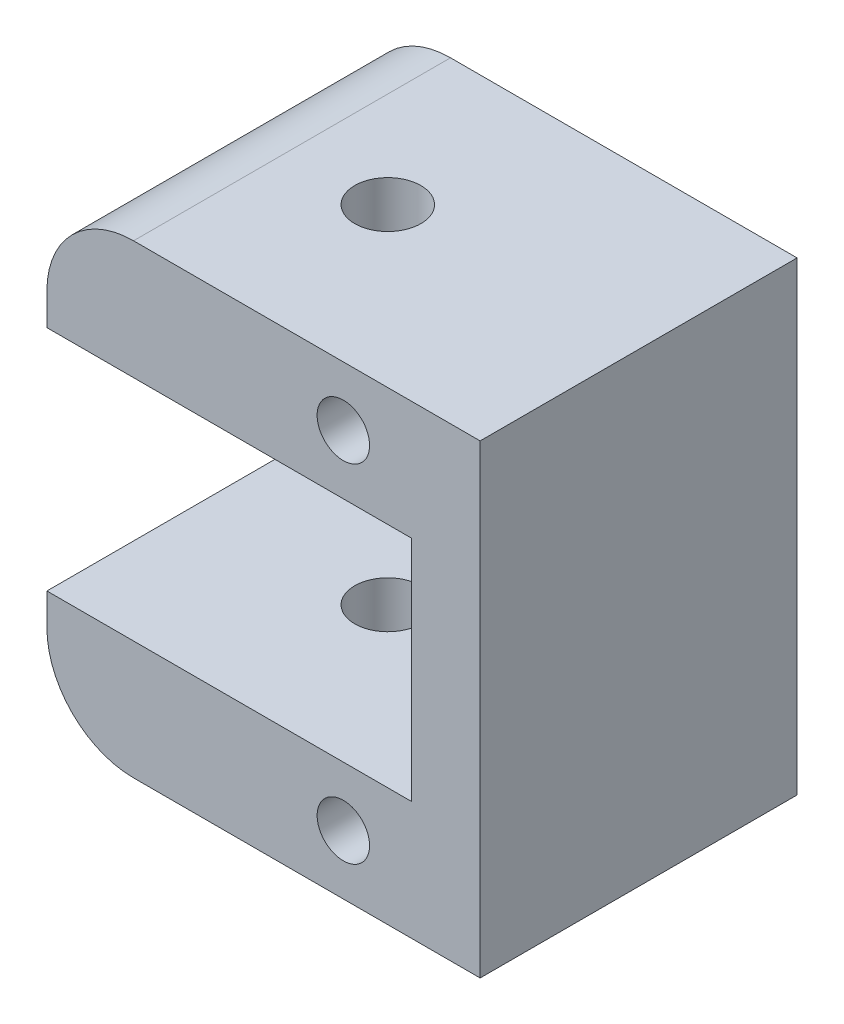
ISO-10303-21;
HEADER;
FILE_DESCRIPTION(('STEP AP214'),'2;1');
FILE_NAME('part.step','',(''),(''),'','','');
FILE_SCHEMA(('AUTOMOTIVE_DESIGN { 1 0 10303 214 1 1 1 1 }'));
ENDSEC;
DATA;
#1=APPLICATION_CONTEXT('core data for automotive mechanical design processes');
#2=APPLICATION_PROTOCOL_DEFINITION('international standard','automotive_design',2000,#1);
#3=PRODUCT_CONTEXT('',#1,'mechanical');
#4=PRODUCT('Part','Part','',(#3));
#5=PRODUCT_RELATED_PRODUCT_CATEGORY('part','',(#4));
#6=PRODUCT_DEFINITION_FORMATION('','',#4);
#7=PRODUCT_DEFINITION_CONTEXT('part definition',#1,'design');
#8=PRODUCT_DEFINITION('design','',#6,#7);
#9=PRODUCT_DEFINITION_SHAPE('','',#8);
#10=(LENGTH_UNIT() NAMED_UNIT(*) SI_UNIT(.MILLI.,.METRE.));
#11=(NAMED_UNIT(*) PLANE_ANGLE_UNIT() SI_UNIT($,.RADIAN.));
#12=(NAMED_UNIT(*) SI_UNIT($,.STERADIAN.) SOLID_ANGLE_UNIT());
#13=UNCERTAINTY_MEASURE_WITH_UNIT(LENGTH_MEASURE(1.E-05),#10,'distance_accuracy_value','');
#14=(GEOMETRIC_REPRESENTATION_CONTEXT(3) GLOBAL_UNCERTAINTY_ASSIGNED_CONTEXT((#13)) GLOBAL_UNIT_ASSIGNED_CONTEXT((#10,
#11,#12)) REPRESENTATION_CONTEXT('',''));
#15=CARTESIAN_POINT('',(0.,0.,0.));
#16=DIRECTION('',(0.,0.,1.));
#17=DIRECTION('',(1.,0.,0.));
#18=AXIS2_PLACEMENT_3D('',#15,#16,#17);
#19=CARTESIAN_POINT('',(11.,10.2,-13.9));
#20=DIRECTION('',(0.,1.,0.));
#21=DIRECTION('',(-1.,0.,0.));
#22=AXIS2_PLACEMENT_3D('',#19,#20,#21);
#23=PLANE('',#22);
#24=CARTESIAN_POINT('',(0.,10.2,-6.95));
#25=DIRECTION('',(0.,1.,0.));
#26=DIRECTION('',(-1.,0.,0.));
#27=AXIS2_PLACEMENT_3D('',#24,#25,#26);
#28=CIRCLE('',#27,1.45);
#29=CARTESIAN_POINT('',(-1.45,10.2,-6.95));
#30=VERTEX_POINT('',#29);
#31=EDGE_CURVE('E261',#30,#30,#28,.T.);
#32=ORIENTED_EDGE('',*,*,#31,.F.);
#33=EDGE_LOOP('',(#32));
#34=FACE_BOUND('',#33,.T.);
#35=DIRECTION('',(-1.,0.,0.));
#36=VECTOR('',#35,1.);
#37=CARTESIAN_POINT('',(11.,10.2,-13.9));
#38=LINE('',#37,#36);
#39=CARTESIAN_POINT('',(11.,10.2,-13.9));
#40=VERTEX_POINT('',#39);
#41=CARTESIAN_POINT('',(-4.2,10.2,-13.9));
#42=VERTEX_POINT('',#41);
#43=EDGE_CURVE('E123',#40,#42,#38,.T.);
#44=ORIENTED_EDGE('',*,*,#43,.T.);
#45=DIRECTION('',(0.,0.,1.));
#46=VECTOR('',#45,1.);
#47=CARTESIAN_POINT('',(-4.2,10.2,-13.9));
#48=LINE('',#47,#46);
#49=CARTESIAN_POINT('',(-4.2,10.2,0.));
#50=VERTEX_POINT('',#49);
#51=EDGE_CURVE('E48',#42,#50,#48,.T.);
#52=ORIENTED_EDGE('',*,*,#51,.T.);
#53=DIRECTION('',(-1.,0.,0.));
#54=VECTOR('',#53,1.);
#55=CARTESIAN_POINT('',(11.,10.2,0.));
#56=LINE('',#55,#54);
#57=CARTESIAN_POINT('',(11.,10.2,0.));
#58=VERTEX_POINT('',#57);
#59=EDGE_CURVE('E160',#58,#50,#56,.T.);
#60=ORIENTED_EDGE('',*,*,#59,.F.);
#61=DIRECTION('',(0.,0.,1.));
#62=VECTOR('',#61,1.);
#63=CARTESIAN_POINT('',(11.,10.2,-13.9));
#64=LINE('',#63,#62);
#65=EDGE_CURVE('E189',#40,#58,#64,.T.);
#66=ORIENTED_EDGE('',*,*,#65,.F.);
#67=EDGE_LOOP('',(#44,#52,#60,#66));
#68=FACE_BOUND('',#67,.T.);
#69=ADVANCED_FACE('F39',(#34,#68),#23,.T.);
#70=CARTESIAN_POINT('',(11.,-10.2,-13.9));
#71=DIRECTION('',(1.,0.,0.));
#72=DIRECTION('',(0.,0.,-1.));
#73=AXIS2_PLACEMENT_3D('',#70,#71,#72);
#74=PLANE('',#73);
#75=DIRECTION('',(0.,1.,0.));
#76=VECTOR('',#75,1.);
#77=CARTESIAN_POINT('',(11.,-10.2,0.));
#78=LINE('',#77,#76);
#79=CARTESIAN_POINT('',(11.,-10.2,0.));
#80=VERTEX_POINT('',#79);
#81=EDGE_CURVE('E185',#80,#58,#78,.T.);
#82=ORIENTED_EDGE('',*,*,#81,.F.);
#83=DIRECTION('',(0.,0.,1.));
#84=VECTOR('',#83,1.);
#85=CARTESIAN_POINT('',(11.,-10.2,-13.9));
#86=LINE('',#85,#84);
#87=CARTESIAN_POINT('',(11.,-10.2,-13.9));
#88=VERTEX_POINT('',#87);
#89=EDGE_CURVE('E193',#88,#80,#86,.T.);
#90=ORIENTED_EDGE('',*,*,#89,.F.);
#91=DIRECTION('',(0.,1.,0.));
#92=VECTOR('',#91,1.);
#93=CARTESIAN_POINT('',(11.,-10.2,-13.9));
#94=LINE('',#93,#92);
#95=EDGE_CURVE('E132',#88,#40,#94,.T.);
#96=ORIENTED_EDGE('',*,*,#95,.T.);
#97=ORIENTED_EDGE('',*,*,#65,.T.);
#98=EDGE_LOOP('',(#82,#90,#96,#97));
#99=FACE_BOUND('',#98,.T.);
#100=ADVANCED_FACE('F247',(#99),#74,.T.);
#101=CARTESIAN_POINT('',(-7.99999999999999,-10.2,-13.9));
#102=DIRECTION('',(0.,-1.,0.));
#103=DIRECTION('',(0.,0.,-1.));
#104=AXIS2_PLACEMENT_3D('',#101,#102,#103);
#105=PLANE('',#104);
#106=CARTESIAN_POINT('',(0.,-10.2,-6.95));
#107=DIRECTION('',(0.,1.,0.));
#108=DIRECTION('',(-1.,0.,0.));
#109=AXIS2_PLACEMENT_3D('',#106,#107,#108);
#110=CIRCLE('',#109,1.45);
#111=CARTESIAN_POINT('',(-1.45,-10.2,-6.95));
#112=VERTEX_POINT('',#111);
#113=EDGE_CURVE('E218',#112,#112,#110,.T.);
#114=ORIENTED_EDGE('',*,*,#113,.T.);
#115=EDGE_LOOP('',(#114));
#116=FACE_BOUND('',#115,.T.);
#117=DIRECTION('',(1.,0.,0.));
#118=VECTOR('',#117,1.);
#119=CARTESIAN_POINT('',(-7.99999999999999,-10.2,0.));
#120=LINE('',#119,#118);
#121=CARTESIAN_POINT('',(-4.2,-10.2,0.));
#122=VERTEX_POINT('',#121);
#123=EDGE_CURVE('E182',#122,#80,#120,.T.);
#124=ORIENTED_EDGE('',*,*,#123,.F.);
#125=DIRECTION('',(0.,0.,1.));
#126=VECTOR('',#125,1.);
#127=CARTESIAN_POINT('',(-4.2,-10.2,-13.9));
#128=LINE('',#127,#126);
#129=CARTESIAN_POINT('',(-4.2,-10.2,-13.9));
#130=VERTEX_POINT('',#129);
#131=EDGE_CURVE('E228',#122,#130,#128,.F.);
#132=ORIENTED_EDGE('',*,*,#131,.T.);
#133=DIRECTION('',(1.,0.,0.));
#134=VECTOR('',#133,1.);
#135=CARTESIAN_POINT('',(-7.99999999999999,-10.2,-13.9));
#136=LINE('',#135,#134);
#137=EDGE_CURVE('E154',#130,#88,#136,.T.);
#138=ORIENTED_EDGE('',*,*,#137,.T.);
#139=ORIENTED_EDGE('',*,*,#89,.T.);
#140=EDGE_LOOP('',(#124,#132,#138,#139));
#141=FACE_BOUND('',#140,.T.);
#142=ADVANCED_FACE('F269',(#116,#141),#105,.T.);
#143=CARTESIAN_POINT('',(-8.,-5.,-13.9));
#144=DIRECTION('',(-1.,0.,0.));
#145=DIRECTION('',(0.,-1.,0.));
#146=AXIS2_PLACEMENT_3D('',#143,#144,#145);
#147=PLANE('',#146);
#148=DIRECTION('',(0.,-1.,0.));
#149=VECTOR('',#148,1.);
#150=CARTESIAN_POINT('',(-8.,-5.,-13.9));
#151=LINE('',#150,#149);
#152=CARTESIAN_POINT('',(-8.,-5.,-13.9));
#153=VERTEX_POINT('',#152);
#154=CARTESIAN_POINT('',(-7.99999999999999,-6.40000000000001,-13.9));
#155=VERTEX_POINT('',#154);
#156=EDGE_CURVE('E150',#153,#155,#151,.T.);
#157=ORIENTED_EDGE('',*,*,#156,.T.);
#158=DIRECTION('',(0.,0.,1.));
#159=VECTOR('',#158,1.);
#160=CARTESIAN_POINT('',(-7.99999999999999,-6.40000000000001,-13.9));
#161=LINE('',#160,#159);
#162=CARTESIAN_POINT('',(-7.99999999999999,-6.40000000000001,0.));
#163=VERTEX_POINT('',#162);
#164=EDGE_CURVE('E192',#155,#163,#161,.T.);
#165=ORIENTED_EDGE('',*,*,#164,.T.);
#166=DIRECTION('',(0.,-1.,0.));
#167=VECTOR('',#166,1.);
#168=CARTESIAN_POINT('',(-8.,-5.,0.));
#169=LINE('',#168,#167);
#170=CARTESIAN_POINT('',(-8.,-5.,0.));
#171=VERTEX_POINT('',#170);
#172=EDGE_CURVE('E178',#171,#163,#169,.T.);
#173=ORIENTED_EDGE('',*,*,#172,.F.);
#174=DIRECTION('',(0.,0.,1.));
#175=VECTOR('',#174,1.);
#176=CARTESIAN_POINT('',(-8.,-5.,-13.9));
#177=LINE('',#176,#175);
#178=EDGE_CURVE('E197',#153,#171,#177,.T.);
#179=ORIENTED_EDGE('',*,*,#178,.F.);
#180=EDGE_LOOP('',(#157,#165,#173,#179));
#181=FACE_BOUND('',#180,.T.);
#182=ADVANCED_FACE('F307',(#181),#147,.T.);
#183=CARTESIAN_POINT('',(8.,-5.,-13.9));
#184=DIRECTION('',(0.,1.,0.));
#185=DIRECTION('',(-1.,0.,0.));
#186=AXIS2_PLACEMENT_3D('',#183,#184,#185);
#187=PLANE('',#186);
#188=CARTESIAN_POINT('',(0.,-5.,-6.95));
#189=DIRECTION('',(0.,1.,0.));
#190=DIRECTION('',(-1.,0.,0.));
#191=AXIS2_PLACEMENT_3D('',#188,#189,#190);
#192=CIRCLE('',#191,1.45);
#193=CARTESIAN_POINT('',(-1.45,-5.,-6.95));
#194=VERTEX_POINT('',#193);
#195=EDGE_CURVE('E217',#194,#194,#192,.T.);
#196=ORIENTED_EDGE('',*,*,#195,.F.);
#197=EDGE_LOOP('',(#196));
#198=FACE_BOUND('',#197,.T.);
#199=DIRECTION('',(-1.,0.,0.));
#200=VECTOR('',#199,1.);
#201=CARTESIAN_POINT('',(8.,-5.,0.));
#202=LINE('',#201,#200);
#203=CARTESIAN_POINT('',(8.,-5.,0.));
#204=VERTEX_POINT('',#203);
#205=EDGE_CURVE('E174',#204,#171,#202,.T.);
#206=ORIENTED_EDGE('',*,*,#205,.F.);
#207=DIRECTION('',(0.,0.,1.));
#208=VECTOR('',#207,1.);
#209=CARTESIAN_POINT('',(8.,-5.,-13.9));
#210=LINE('',#209,#208);
#211=CARTESIAN_POINT('',(8.,-5.,-13.9));
#212=VERTEX_POINT('',#211);
#213=EDGE_CURVE('E200',#212,#204,#210,.T.);
#214=ORIENTED_EDGE('',*,*,#213,.F.);
#215=DIRECTION('',(-1.,0.,0.));
#216=VECTOR('',#215,1.);
#217=CARTESIAN_POINT('',(8.,-5.,-13.9));
#218=LINE('',#217,#216);
#219=EDGE_CURVE('E143',#212,#153,#218,.T.);
#220=ORIENTED_EDGE('',*,*,#219,.T.);
#221=ORIENTED_EDGE('',*,*,#178,.T.);
#222=EDGE_LOOP('',(#206,#214,#220,#221));
#223=FACE_BOUND('',#222,.T.);
#224=ADVANCED_FACE('F303',(#198,#223),#187,.T.);
#225=CARTESIAN_POINT('',(8.,5.,-13.9));
#226=DIRECTION('',(-1.,0.,0.));
#227=DIRECTION('',(0.,-1.,0.));
#228=AXIS2_PLACEMENT_3D('',#225,#226,#227);
#229=PLANE('',#228);
#230=DIRECTION('',(0.,-1.,0.));
#231=VECTOR('',#230,1.);
#232=CARTESIAN_POINT('',(8.,5.,0.));
#233=LINE('',#232,#231);
#234=CARTESIAN_POINT('',(8.,5.,0.));
#235=VERTEX_POINT('',#234);
#236=EDGE_CURVE('E170',#235,#204,#233,.T.);
#237=ORIENTED_EDGE('',*,*,#236,.F.);
#238=DIRECTION('',(0.,0.,1.));
#239=VECTOR('',#238,1.);
#240=CARTESIAN_POINT('',(8.,5.,-13.9));
#241=LINE('',#240,#239);
#242=CARTESIAN_POINT('',(8.,5.,-13.9));
#243=VERTEX_POINT('',#242);
#244=EDGE_CURVE('E131',#243,#235,#241,.T.);
#245=ORIENTED_EDGE('',*,*,#244,.F.);
#246=DIRECTION('',(0.,-1.,0.));
#247=VECTOR('',#246,1.);
#248=CARTESIAN_POINT('',(8.,5.,-13.9));
#249=LINE('',#248,#247);
#250=EDGE_CURVE('E139',#243,#212,#249,.T.);
#251=ORIENTED_EDGE('',*,*,#250,.T.);
#252=ORIENTED_EDGE('',*,*,#213,.T.);
#253=EDGE_LOOP('',(#237,#245,#251,#252));
#254=FACE_BOUND('',#253,.T.);
#255=ADVANCED_FACE('F299',(#254),#229,.T.);
#256=CARTESIAN_POINT('',(-8.,5.,-13.9));
#257=DIRECTION('',(0.,-1.,0.));
#258=DIRECTION('',(0.,0.,-1.));
#259=AXIS2_PLACEMENT_3D('',#256,#257,#258);
#260=PLANE('',#259);
#261=CARTESIAN_POINT('',(0.,5.,-6.95));
#262=DIRECTION('',(0.,-1.,0.));
#263=DIRECTION('',(0.,0.,-1.));
#264=AXIS2_PLACEMENT_3D('',#261,#262,#263);
#265=CIRCLE('',#264,1.45);
#266=CARTESIAN_POINT('',(0.,5.,-8.4));
#267=VERTEX_POINT('',#266);
#268=EDGE_CURVE('E213',#267,#267,#265,.T.);
#269=ORIENTED_EDGE('',*,*,#268,.F.);
#270=EDGE_LOOP('',(#269));
#271=FACE_BOUND('',#270,.T.);
#272=DIRECTION('',(1.,0.,0.));
#273=VECTOR('',#272,1.);
#274=CARTESIAN_POINT('',(-8.,5.,0.));
#275=LINE('',#274,#273);
#276=CARTESIAN_POINT('',(-8.,5.,0.));
#277=VERTEX_POINT('',#276);
#278=EDGE_CURVE('E129',#277,#235,#275,.T.);
#279=ORIENTED_EDGE('',*,*,#278,.F.);
#280=DIRECTION('',(0.,0.,1.));
#281=VECTOR('',#280,1.);
#282=CARTESIAN_POINT('',(-8.,5.,-13.9));
#283=LINE('',#282,#281);
#284=CARTESIAN_POINT('',(-8.,5.,-13.9));
#285=VERTEX_POINT('',#284);
#286=EDGE_CURVE('E118',#285,#277,#283,.T.);
#287=ORIENTED_EDGE('',*,*,#286,.F.);
#288=DIRECTION('',(1.,0.,0.));
#289=VECTOR('',#288,1.);
#290=CARTESIAN_POINT('',(-8.,5.,-13.9));
#291=LINE('',#290,#289);
#292=EDGE_CURVE('E122',#285,#243,#291,.T.);
#293=ORIENTED_EDGE('',*,*,#292,.T.);
#294=ORIENTED_EDGE('',*,*,#244,.T.);
#295=EDGE_LOOP('',(#279,#287,#293,#294));
#296=FACE_BOUND('',#295,.T.);
#297=ADVANCED_FACE('F127',(#271,#296),#260,.T.);
#298=CARTESIAN_POINT('',(-8.,10.2,-13.9));
#299=DIRECTION('',(-1.,0.,0.));
#300=DIRECTION('',(0.,-1.,0.));
#301=AXIS2_PLACEMENT_3D('',#298,#299,#300);
#302=PLANE('',#301);
#303=DIRECTION('',(0.,-1.,0.));
#304=VECTOR('',#303,1.);
#305=CARTESIAN_POINT('',(-8.,10.2,0.));
#306=LINE('',#305,#304);
#307=CARTESIAN_POINT('',(-8.,6.4,0.));
#308=VERTEX_POINT('',#307);
#309=EDGE_CURVE('E164',#308,#277,#306,.T.);
#310=ORIENTED_EDGE('',*,*,#309,.F.);
#311=DIRECTION('',(0.,0.,1.));
#312=VECTOR('',#311,1.);
#313=CARTESIAN_POINT('',(-8.,6.4,-13.9));
#314=LINE('',#313,#312);
#315=CARTESIAN_POINT('',(-8.,6.4,-13.9));
#316=VERTEX_POINT('',#315);
#317=EDGE_CURVE('E11',#308,#316,#314,.F.);
#318=ORIENTED_EDGE('',*,*,#317,.T.);
#319=DIRECTION('',(0.,-1.,0.));
#320=VECTOR('',#319,1.);
#321=CARTESIAN_POINT('',(-8.,10.2,-13.9));
#322=LINE('',#321,#320);
#323=EDGE_CURVE('E115',#316,#285,#322,.T.);
#324=ORIENTED_EDGE('',*,*,#323,.T.);
#325=ORIENTED_EDGE('',*,*,#286,.T.);
#326=EDGE_LOOP('',(#310,#318,#324,#325));
#327=FACE_BOUND('',#326,.T.);
#328=ADVANCED_FACE('F117',(#327),#302,.T.);
#329=CARTESIAN_POINT('',(0.,0.,-13.9));
#330=DIRECTION('',(0.,0.,1.));
#331=DIRECTION('',(1.,0.,0.));
#332=AXIS2_PLACEMENT_3D('',#329,#330,#331);
#333=PLANE('',#332);
#334=CARTESIAN_POINT('',(5.,7.6,-13.9));
#335=DIRECTION('',(0.,0.,1.));
#336=DIRECTION('',(1.,0.,0.));
#337=AXIS2_PLACEMENT_3D('',#334,#335,#336);
#338=CIRCLE('',#337,1.15);
#339=CARTESIAN_POINT('',(6.15,7.6,-13.9));
#340=VERTEX_POINT('',#339);
#341=EDGE_CURVE('E209',#340,#340,#338,.T.);
#342=ORIENTED_EDGE('',*,*,#341,.T.);
#343=EDGE_LOOP('',(#342));
#344=FACE_BOUND('',#343,.T.);
#345=CARTESIAN_POINT('',(5.00000000000016,-7.6,-13.9));
#346=DIRECTION('',(0.,0.,1.));
#347=DIRECTION('',(1.,0.,0.));
#348=AXIS2_PLACEMENT_3D('',#345,#346,#347);
#349=CIRCLE('',#348,1.15);
#350=CARTESIAN_POINT('',(6.15000000000016,-7.6,-13.9));
#351=VERTEX_POINT('',#350);
#352=EDGE_CURVE('E251',#351,#351,#349,.T.);
#353=ORIENTED_EDGE('',*,*,#352,.T.);
#354=EDGE_LOOP('',(#353));
#355=FACE_BOUND('',#354,.T.);
#356=ORIENTED_EDGE('',*,*,#137,.F.);
#357=CARTESIAN_POINT('',(-4.2,-6.4,-13.9));
#358=DIRECTION('',(0.,0.,1.));
#359=DIRECTION('',(1.,0.,0.));
#360=AXIS2_PLACEMENT_3D('',#357,#358,#359);
#361=CIRCLE('',#360,3.8);
#362=EDGE_CURVE('E233',#130,#155,#361,.F.);
#363=ORIENTED_EDGE('',*,*,#362,.T.);
#364=ORIENTED_EDGE('',*,*,#156,.F.);
#365=ORIENTED_EDGE('',*,*,#219,.F.);
#366=ORIENTED_EDGE('',*,*,#250,.F.);
#367=ORIENTED_EDGE('',*,*,#292,.F.);
#368=ORIENTED_EDGE('',*,*,#323,.F.);
#369=CARTESIAN_POINT('',(-4.2,6.4,-13.9));
#370=DIRECTION('',(0.,0.,1.));
#371=DIRECTION('',(1.,0.,0.));
#372=AXIS2_PLACEMENT_3D('',#369,#370,#371);
#373=CIRCLE('',#372,3.8);
#374=EDGE_CURVE('E60',#316,#42,#373,.F.);
#375=ORIENTED_EDGE('',*,*,#374,.T.);
#376=ORIENTED_EDGE('',*,*,#43,.F.);
#377=ORIENTED_EDGE('',*,*,#95,.F.);
#378=EDGE_LOOP('',(#356,#363,#364,#365,#366,#367,#368,#375,#376,#377));
#379=FACE_BOUND('',#378,.T.);
#380=ADVANCED_FACE('F136',(#344,#355,#379),#333,.F.);
#381=CARTESIAN_POINT('',(0.,0.,0.));
#382=DIRECTION('',(0.,0.,1.));
#383=DIRECTION('',(1.,0.,0.));
#384=AXIS2_PLACEMENT_3D('',#381,#382,#383);
#385=PLANE('',#384);
#386=CARTESIAN_POINT('',(5.,7.6,0.));
#387=DIRECTION('',(0.,0.,1.));
#388=DIRECTION('',(1.,0.,0.));
#389=AXIS2_PLACEMENT_3D('',#386,#387,#388);
#390=CIRCLE('',#389,1.15);
#391=CARTESIAN_POINT('',(6.15,7.6,0.));
#392=VERTEX_POINT('',#391);
#393=EDGE_CURVE('E165',#392,#392,#390,.T.);
#394=ORIENTED_EDGE('',*,*,#393,.F.);
#395=EDGE_LOOP('',(#394));
#396=FACE_BOUND('',#395,.T.);
#397=CARTESIAN_POINT('',(5.00000000000016,-7.6,0.));
#398=DIRECTION('',(0.,0.,1.));
#399=DIRECTION('',(1.,0.,0.));
#400=AXIS2_PLACEMENT_3D('',#397,#398,#399);
#401=CIRCLE('',#400,1.15);
#402=CARTESIAN_POINT('',(6.15000000000016,-7.6,0.));
#403=VERTEX_POINT('',#402);
#404=EDGE_CURVE('E205',#403,#403,#401,.T.);
#405=ORIENTED_EDGE('',*,*,#404,.F.);
#406=EDGE_LOOP('',(#405));
#407=FACE_BOUND('',#406,.T.);
#408=ORIENTED_EDGE('',*,*,#172,.T.);
#409=CARTESIAN_POINT('',(-4.2,-6.4,0.));
#410=DIRECTION('',(0.,0.,1.));
#411=DIRECTION('',(1.,0.,0.));
#412=AXIS2_PLACEMENT_3D('',#409,#410,#411);
#413=CIRCLE('',#412,3.8);
#414=EDGE_CURVE('E225',#163,#122,#413,.T.);
#415=ORIENTED_EDGE('',*,*,#414,.T.);
#416=ORIENTED_EDGE('',*,*,#123,.T.);
#417=ORIENTED_EDGE('',*,*,#81,.T.);
#418=ORIENTED_EDGE('',*,*,#59,.T.);
#419=CARTESIAN_POINT('',(-4.2,6.4,0.));
#420=DIRECTION('',(0.,0.,1.));
#421=DIRECTION('',(1.,0.,0.));
#422=AXIS2_PLACEMENT_3D('',#419,#420,#421);
#423=CIRCLE('',#422,3.8);
#424=EDGE_CURVE('E222',#50,#308,#423,.T.);
#425=ORIENTED_EDGE('',*,*,#424,.T.);
#426=ORIENTED_EDGE('',*,*,#309,.T.);
#427=ORIENTED_EDGE('',*,*,#278,.T.);
#428=ORIENTED_EDGE('',*,*,#236,.T.);
#429=ORIENTED_EDGE('',*,*,#205,.T.);
#430=EDGE_LOOP('',(#408,#415,#416,#417,#418,#425,#426,#427,#428,#429));
#431=FACE_BOUND('',#430,.T.);
#432=ADVANCED_FACE('F242',(#396,#407,#431),#385,.T.);
#433=CARTESIAN_POINT('',(5.00000000000016,-7.6,-13.9));
#434=DIRECTION('',(0.,0.,1.));
#435=DIRECTION('',(1.,0.,0.));
#436=AXIS2_PLACEMENT_3D('',#433,#434,#435);
#437=CYLINDRICAL_SURFACE('',#436,1.15);
#438=ORIENTED_EDGE('',*,*,#404,.T.);
#439=EDGE_LOOP('',(#438));
#440=FACE_BOUND('',#439,.T.);
#441=ORIENTED_EDGE('',*,*,#352,.F.);
#442=EDGE_LOOP('',(#441));
#443=FACE_BOUND('',#442,.T.);
#444=ADVANCED_FACE('F316',(#440,#443),#437,.F.);
#445=CARTESIAN_POINT('',(5.,7.6,-13.9));
#446=DIRECTION('',(0.,0.,1.));
#447=DIRECTION('',(1.,0.,0.));
#448=AXIS2_PLACEMENT_3D('',#445,#446,#447);
#449=CYLINDRICAL_SURFACE('',#448,1.15);
#450=ORIENTED_EDGE('',*,*,#393,.T.);
#451=EDGE_LOOP('',(#450));
#452=FACE_BOUND('',#451,.T.);
#453=ORIENTED_EDGE('',*,*,#341,.F.);
#454=EDGE_LOOP('',(#453));
#455=FACE_BOUND('',#454,.T.);
#456=ADVANCED_FACE('F283',(#452,#455),#449,.F.);
#457=CARTESIAN_POINT('',(0.,-10.2,-6.95));
#458=DIRECTION('',(0.,1.,0.));
#459=DIRECTION('',(-1.,0.,0.));
#460=AXIS2_PLACEMENT_3D('',#457,#458,#459);
#461=CYLINDRICAL_SURFACE('',#460,1.45);
#462=ORIENTED_EDGE('',*,*,#268,.T.);
#463=EDGE_LOOP('',(#462));
#464=FACE_BOUND('',#463,.T.);
#465=ORIENTED_EDGE('',*,*,#31,.T.);
#466=EDGE_LOOP('',(#465));
#467=FACE_BOUND('',#466,.T.);
#468=ADVANCED_FACE('F275',(#464,#467),#461,.F.);
#469=ORIENTED_EDGE('',*,*,#195,.T.);
#470=EDGE_LOOP('',(#469));
#471=FACE_BOUND('',#470,.T.);
#472=ORIENTED_EDGE('',*,*,#113,.F.);
#473=EDGE_LOOP('',(#472));
#474=FACE_BOUND('',#473,.T.);
#475=ADVANCED_FACE('F272',(#471,#474),#461,.F.);
#476=CARTESIAN_POINT('',(-4.2,-6.4,-13.9));
#477=DIRECTION('',(0.,0.,1.));
#478=DIRECTION('',(1.,0.,0.));
#479=AXIS2_PLACEMENT_3D('',#476,#477,#478);
#480=CYLINDRICAL_SURFACE('',#479,3.8);
#481=ORIENTED_EDGE('',*,*,#362,.F.);
#482=ORIENTED_EDGE('',*,*,#131,.F.);
#483=ORIENTED_EDGE('',*,*,#414,.F.);
#484=ORIENTED_EDGE('',*,*,#164,.F.);
#485=EDGE_LOOP('',(#481,#482,#483,#484));
#486=FACE_BOUND('',#485,.T.);
#487=ADVANCED_FACE('F274',(#486),#480,.T.);
#488=CARTESIAN_POINT('',(-4.2,6.4,-13.9));
#489=DIRECTION('',(0.,0.,1.));
#490=DIRECTION('',(1.,0.,0.));
#491=AXIS2_PLACEMENT_3D('',#488,#489,#490);
#492=CYLINDRICAL_SURFACE('',#491,3.8);
#493=ORIENTED_EDGE('',*,*,#374,.F.);
#494=ORIENTED_EDGE('',*,*,#317,.F.);
#495=ORIENTED_EDGE('',*,*,#424,.F.);
#496=ORIENTED_EDGE('',*,*,#51,.F.);
#497=EDGE_LOOP('',(#493,#494,#495,#496));
#498=FACE_BOUND('',#497,.T.);
#499=ADVANCED_FACE('F41',(#498),#492,.T.);
#500=CLOSED_SHELL('',(#69,#100,#142,#182,#224,#255,#297,#328,#380,#432,#444,#456,#468,#475,#487,#499));
#501=MANIFOLD_SOLID_BREP('B2',#500);
#502=ADVANCED_BREP_SHAPE_REPRESENTATION('',(#18,#501),#14);
#503=SHAPE_DEFINITION_REPRESENTATION(#9,#502);
ENDSEC;
END-ISO-10303-21;
